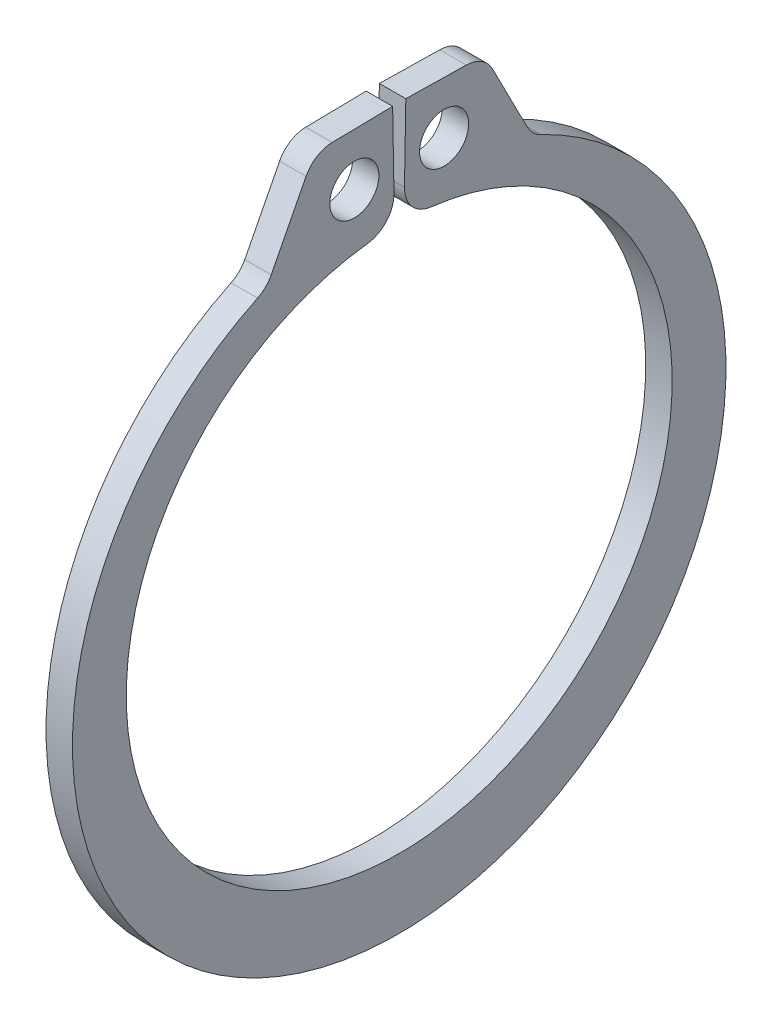
ISO-10303-21;
HEADER;
FILE_DESCRIPTION(('STEP AP214'),'2;1');
FILE_NAME('part.step','',(''),(''),'','','');
FILE_SCHEMA(('AUTOMOTIVE_DESIGN { 1 0 10303 214 1 1 1 1 }'));
ENDSEC;
DATA;
#1=APPLICATION_CONTEXT('core data for automotive mechanical design processes');
#2=APPLICATION_PROTOCOL_DEFINITION('international standard','automotive_design',2000,#1);
#3=PRODUCT_CONTEXT('',#1,'mechanical');
#4=PRODUCT('Part','Part','',(#3));
#5=PRODUCT_RELATED_PRODUCT_CATEGORY('part','',(#4));
#6=PRODUCT_DEFINITION_FORMATION('','',#4);
#7=PRODUCT_DEFINITION_CONTEXT('part definition',#1,'design');
#8=PRODUCT_DEFINITION('design','',#6,#7);
#9=PRODUCT_DEFINITION_SHAPE('','',#8);
#10=(LENGTH_UNIT() NAMED_UNIT(*) SI_UNIT(.MILLI.,.METRE.));
#11=(NAMED_UNIT(*) PLANE_ANGLE_UNIT() SI_UNIT($,.RADIAN.));
#12=(NAMED_UNIT(*) SI_UNIT($,.STERADIAN.) SOLID_ANGLE_UNIT());
#13=UNCERTAINTY_MEASURE_WITH_UNIT(LENGTH_MEASURE(1.E-05),#10,'distance_accuracy_value','');
#14=(GEOMETRIC_REPRESENTATION_CONTEXT(3) GLOBAL_UNCERTAINTY_ASSIGNED_CONTEXT((#13)) GLOBAL_UNIT_ASSIGNED_CONTEXT((#10,
#11,#12)) REPRESENTATION_CONTEXT('',''));
#15=CARTESIAN_POINT('',(0.,0.,0.));
#16=DIRECTION('',(0.,0.,1.));
#17=DIRECTION('',(1.,0.,0.));
#18=AXIS2_PLACEMENT_3D('',#15,#16,#17);
#19=CARTESIAN_POINT('',(0.5334,-0.625118312705631,0.));
#20=DIRECTION('',(1.,0.,0.));
#21=DIRECTION('',(0.,0.,-1.));
#22=AXIS2_PLACEMENT_3D('',#19,#20,#21);
#23=PLANE('',#22);
#24=CARTESIAN_POINT('',(0.5334,13.0895070250879,1.80986904848789));
#25=DIRECTION('',(1.,0.,0.));
#26=DIRECTION('',(0.,0.,-1.));
#27=AXIS2_PLACEMENT_3D('',#24,#25,#26);
#28=CIRCLE('',#27,0.9906);
#29=CARTESIAN_POINT('',(0.5334,13.0895070250879,0.819269048487891));
#30=VERTEX_POINT('',#29);
#31=EDGE_CURVE('E183',#30,#30,#28,.T.);
#32=ORIENTED_EDGE('',*,*,#31,.F.);
#33=EDGE_LOOP('',(#32));
#34=FACE_BOUND('',#33,.T.);
#35=DIRECTION('',(0.,0.889652132655338,0.456638897666206));
#36=VECTOR('',#35,1.);
#37=CARTESIAN_POINT('',(0.5334,15.1697910635783,-3.4275713949355));
#38=LINE('',#37,#36);
#39=CARTESIAN_POINT('',(0.5334,11.7880795835457,-5.1633296152392));
#40=VERTEX_POINT('',#39);
#41=CARTESIAN_POINT('',(0.5334,14.527018981979,-3.75749218534158));
#42=VERTEX_POINT('',#41);
#43=EDGE_CURVE('E189',#40,#42,#38,.T.);
#44=ORIENTED_EDGE('',*,*,#43,.T.);
#45=CARTESIAN_POINT('',(0.5334,13.9760841519447,-2.68412688729291));
#46=DIRECTION('',(1.,0.,0.));
#47=DIRECTION('',(0.,0.,-1.));
#48=AXIS2_PLACEMENT_3D('',#45,#46,#47);
#49=CIRCLE('',#48,1.2065);
#50=CARTESIAN_POINT('',(0.5334,15.1824003961509,-2.7051832156595));
#51=VERTEX_POINT('',#50);
#52=EDGE_CURVE('E228',#42,#51,#49,.T.);
#53=ORIENTED_EDGE('',*,*,#52,.T.);
#54=DIRECTION('',(0.,0.0174524064372839,0.999847695156391));
#55=VECTOR('',#54,1.);
#56=CARTESIAN_POINT('',(0.5334,15.2249808084549,-0.265753028542447));
#57=LINE('',#56,#55);
#58=CARTESIAN_POINT('',(0.5334,15.2249808084549,-0.265753028542447));
#59=VERTEX_POINT('',#58);
#60=EDGE_CURVE('E192',#51,#59,#57,.T.);
#61=ORIENTED_EDGE('',*,*,#60,.T.);
#62=DIRECTION('',(0.,-0.999847695156391,0.0174524064372838));
#63=VECTOR('',#62,1.);
#64=CARTESIAN_POINT('',(0.5334,11.0092229865975,-0.192166702040283));
#65=LINE('',#64,#63);
#66=CARTESIAN_POINT('',(0.5334,12.1558298695839,-0.212180799629953));
#67=VERTEX_POINT('',#66);
#68=EDGE_CURVE('E160',#59,#67,#65,.T.);
#69=ORIENTED_EDGE('',*,*,#68,.T.);
#70=CARTESIAN_POINT('',(0.5334,12.1347735412173,-1.41849704383614));
#71=DIRECTION('',(1.,0.,0.));
#72=DIRECTION('',(0.,0.,-1.));
#73=AXIS2_PLACEMENT_3D('',#70,#71,#72);
#74=CIRCLE('',#73,1.2065);
#75=CARTESIAN_POINT('',(0.5334,10.9364331187478,-1.27841677443444));
#76=VERTEX_POINT('',#75);
#77=EDGE_CURVE('E226',#67,#76,#74,.T.);
#78=ORIENTED_EDGE('',*,*,#77,.T.);
#79=CARTESIAN_POINT('',(0.5334,0.,0.));
#80=DIRECTION('',(-1.,0.,0.));
#81=DIRECTION('',(0.,0.,-1.));
#82=AXIS2_PLACEMENT_3D('',#79,#80,#81);
#83=CIRCLE('',#82,11.0109);
#84=CARTESIAN_POINT('',(0.5334,10.9364331187478,1.27841677443444));
#85=VERTEX_POINT('',#84);
#86=EDGE_CURVE('E195',#76,#85,#83,.T.);
#87=ORIENTED_EDGE('',*,*,#86,.T.);
#88=CARTESIAN_POINT('',(0.5334,12.1347735412173,1.41849704383614));
#89=DIRECTION('',(1.,0.,0.));
#90=DIRECTION('',(0.,0.,-1.));
#91=AXIS2_PLACEMENT_3D('',#88,#89,#90);
#92=CIRCLE('',#91,1.2065);
#93=CARTESIAN_POINT('',(0.5334,12.1558298695839,0.212180799629953));
#94=VERTEX_POINT('',#93);
#95=EDGE_CURVE('E224',#85,#94,#92,.T.);
#96=ORIENTED_EDGE('',*,*,#95,.T.);
#97=DIRECTION('',(0.,0.999847695156391,0.0174524064372835));
#98=VECTOR('',#97,1.);
#99=CARTESIAN_POINT('',(0.5334,11.0092229865975,0.192166702040285));
#100=LINE('',#99,#98);
#101=CARTESIAN_POINT('',(0.5334,15.2249808084549,0.265753028542447));
#102=VERTEX_POINT('',#101);
#103=EDGE_CURVE('E198',#94,#102,#100,.T.);
#104=ORIENTED_EDGE('',*,*,#103,.T.);
#105=DIRECTION('',(0.,-0.0174524064372839,0.999847695156391));
#106=VECTOR('',#105,1.);
#107=CARTESIAN_POINT('',(0.5334,15.2249808084549,0.265753028542447));
#108=LINE('',#107,#106);
#109=CARTESIAN_POINT('',(0.5334,15.1824003961509,2.7051832156595));
#110=VERTEX_POINT('',#109);
#111=EDGE_CURVE('E200',#102,#110,#108,.T.);
#112=ORIENTED_EDGE('',*,*,#111,.T.);
#113=CARTESIAN_POINT('',(0.5334,13.9760841519447,2.68412688729291));
#114=DIRECTION('',(1.,0.,0.));
#115=DIRECTION('',(0.,0.,-1.));
#116=AXIS2_PLACEMENT_3D('',#113,#114,#115);
#117=CIRCLE('',#116,1.2065);
#118=CARTESIAN_POINT('',(0.5334,14.527018981979,3.75749218534158));
#119=VERTEX_POINT('',#118);
#120=EDGE_CURVE('E61',#110,#119,#117,.T.);
#121=ORIENTED_EDGE('',*,*,#120,.T.);
#122=DIRECTION('',(0.,-0.889652132655339,0.456638897666205));
#123=VECTOR('',#122,1.);
#124=CARTESIAN_POINT('',(0.5334,15.1697910635783,3.4275713949355));
#125=LINE('',#124,#123);
#126=CARTESIAN_POINT('',(0.5334,11.7880795835457,5.16332961523919));
#127=VERTEX_POINT('',#126);
#128=EDGE_CURVE('E202',#119,#127,#125,.T.);
#129=ORIENTED_EDGE('',*,*,#128,.T.);
#130=CARTESIAN_POINT('',(0.5334,12.33901441358,6.23669491328786));
#131=DIRECTION('',(1.,0.,0.));
#132=DIRECTION('',(0.,0.,-1.));
#133=AXIS2_PLACEMENT_3D('',#130,#131,#132);
#134=CIRCLE('',#133,1.2065);
#135=CARTESIAN_POINT('',(0.5334,11.2517823911404,5.71365688466874));
#136=VERTEX_POINT('',#135);
#137=EDGE_CURVE('E11',#127,#136,#134,.F.);
#138=ORIENTED_EDGE('',*,*,#137,.T.);
#139=CARTESIAN_POINT('',(0.5334,-0.625118312705631,0.));
#140=DIRECTION('',(1.,0.,0.));
#141=DIRECTION('',(0.,0.,-1.));
#142=AXIS2_PLACEMENT_3D('',#139,#140,#141);
#143=CIRCLE('',#142,13.1797816872944);
#144=CARTESIAN_POINT('',(0.5334,11.2517823911404,-5.71365688466874));
#145=VERTEX_POINT('',#144);
#146=EDGE_CURVE('E186',#136,#145,#143,.T.);
#147=ORIENTED_EDGE('',*,*,#146,.T.);
#148=CARTESIAN_POINT('',(0.5334,12.33901441358,-6.23669491328786));
#149=DIRECTION('',(1.,0.,0.));
#150=DIRECTION('',(0.,0.,-1.));
#151=AXIS2_PLACEMENT_3D('',#148,#149,#150);
#152=CIRCLE('',#151,1.2065);
#153=EDGE_CURVE('E248',#145,#40,#152,.F.);
#154=ORIENTED_EDGE('',*,*,#153,.T.);
#155=EDGE_LOOP('',(#44,#53,#61,#69,#78,#87,#96,#104,#112,#121,#129,#138,#147,#154));
#156=FACE_BOUND('',#155,.T.);
#157=CARTESIAN_POINT('',(0.5334,13.0895070250879,-1.80986904848789));
#158=DIRECTION('',(1.,0.,0.));
#159=DIRECTION('',(0.,0.,-1.));
#160=AXIS2_PLACEMENT_3D('',#157,#158,#159);
#161=CIRCLE('',#160,0.990600000000001);
#162=CARTESIAN_POINT('',(0.5334,13.0895070250879,-2.80046904848789));
#163=VERTEX_POINT('',#162);
#164=EDGE_CURVE('E180',#163,#163,#161,.T.);
#165=ORIENTED_EDGE('',*,*,#164,.F.);
#166=EDGE_LOOP('',(#165));
#167=FACE_BOUND('',#166,.T.);
#168=ADVANCED_FACE('F39',(#34,#156,#167),#23,.T.);
#169=CARTESIAN_POINT('',(0.5334,-0.625118312705631,0.));
#170=DIRECTION('',(-1.,0.,0.));
#171=DIRECTION('',(0.,0.,1.));
#172=AXIS2_PLACEMENT_3D('',#169,#170,#171);
#173=CYLINDRICAL_SURFACE('',#172,13.1797816872944);
#174=CARTESIAN_POINT('',(-0.5334,-0.625118312705631,0.));
#175=DIRECTION('',(1.,0.,0.));
#176=DIRECTION('',(0.,0.,-1.));
#177=AXIS2_PLACEMENT_3D('',#174,#175,#176);
#178=CIRCLE('',#177,13.1797816872944);
#179=CARTESIAN_POINT('',(-0.5334,11.2517823911404,5.71365688466874));
#180=VERTEX_POINT('',#179);
#181=CARTESIAN_POINT('',(-0.5334,11.2517823911404,-5.71365688466874));
#182=VERTEX_POINT('',#181);
#183=EDGE_CURVE('E252',#180,#182,#178,.T.);
#184=ORIENTED_EDGE('',*,*,#183,.T.);
#185=DIRECTION('',(-1.,0.,0.));
#186=VECTOR('',#185,1.);
#187=CARTESIAN_POINT('',(0.5334,11.2517823911404,-5.71365688466874));
#188=LINE('',#187,#186);
#189=EDGE_CURVE('E213',#182,#145,#188,.F.);
#190=ORIENTED_EDGE('',*,*,#189,.T.);
#191=ORIENTED_EDGE('',*,*,#146,.F.);
#192=DIRECTION('',(-1.,0.,0.));
#193=VECTOR('',#192,1.);
#194=CARTESIAN_POINT('',(0.5334,11.2517823911404,5.71365688466874));
#195=LINE('',#194,#193);
#196=EDGE_CURVE('E210',#136,#180,#195,.T.);
#197=ORIENTED_EDGE('',*,*,#196,.T.);
#198=EDGE_LOOP('',(#184,#190,#191,#197));
#199=FACE_BOUND('',#198,.T.);
#200=ADVANCED_FACE('F262',(#199),#173,.T.);
#201=CARTESIAN_POINT('',(0.5334,15.1697910635783,-3.4275713949355));
#202=DIRECTION('',(0.,-0.456638897666206,0.889652132655339));
#203=DIRECTION('',(0.,-0.889652132655339,-0.456638897666206));
#204=AXIS2_PLACEMENT_3D('',#201,#202,#203);
#205=PLANE('',#204);
#206=ORIENTED_EDGE('',*,*,#43,.F.);
#207=DIRECTION('',(1.,0.,0.));
#208=VECTOR('',#207,1.);
#209=CARTESIAN_POINT('',(-0.5334,11.7880795835457,-5.1633296152392));
#210=LINE('',#209,#208);
#211=CARTESIAN_POINT('',(-0.5334,11.7880795835457,-5.1633296152392));
#212=VERTEX_POINT('',#211);
#213=EDGE_CURVE('E207',#40,#212,#210,.F.);
#214=ORIENTED_EDGE('',*,*,#213,.T.);
#215=DIRECTION('',(0.,0.889652132655338,0.456638897666206));
#216=VECTOR('',#215,1.);
#217=CARTESIAN_POINT('',(-0.5334,15.1697910635783,-3.4275713949355));
#218=LINE('',#217,#216);
#219=CARTESIAN_POINT('',(-0.5334,14.527018981979,-3.75749218534158));
#220=VERTEX_POINT('',#219);
#221=EDGE_CURVE('E153',#212,#220,#218,.T.);
#222=ORIENTED_EDGE('',*,*,#221,.T.);
#223=DIRECTION('',(-1.,0.,0.));
#224=VECTOR('',#223,1.);
#225=CARTESIAN_POINT('',(0.5334,14.527018981979,-3.75749218534158));
#226=LINE('',#225,#224);
#227=EDGE_CURVE('E161',#220,#42,#226,.F.);
#228=ORIENTED_EDGE('',*,*,#227,.T.);
#229=EDGE_LOOP('',(#206,#214,#222,#228));
#230=FACE_BOUND('',#229,.T.);
#231=ADVANCED_FACE('F270',(#230),#205,.F.);
#232=CARTESIAN_POINT('',(0.5334,15.2249808084549,-0.265753028542447));
#233=DIRECTION('',(0.,-0.999847695156391,0.0174524064372839));
#234=DIRECTION('',(0.,-0.0174524064372839,-0.999847695156391));
#235=AXIS2_PLACEMENT_3D('',#232,#233,#234);
#236=PLANE('',#235);
#237=ORIENTED_EDGE('',*,*,#60,.F.);
#238=DIRECTION('',(-1.,0.,0.));
#239=VECTOR('',#238,1.);
#240=CARTESIAN_POINT('',(0.5334,15.1824003961509,-2.7051832156595));
#241=LINE('',#240,#239);
#242=CARTESIAN_POINT('',(-0.5334,15.1824003961509,-2.7051832156595));
#243=VERTEX_POINT('',#242);
#244=EDGE_CURVE('E149',#51,#243,#241,.T.);
#245=ORIENTED_EDGE('',*,*,#244,.T.);
#246=DIRECTION('',(0.,0.0174524064372839,0.999847695156391));
#247=VECTOR('',#246,1.);
#248=CARTESIAN_POINT('',(-0.5334,15.2249808084549,-0.265753028542447));
#249=LINE('',#248,#247);
#250=CARTESIAN_POINT('',(-0.5334,15.2249808084549,-0.265753028542447));
#251=VERTEX_POINT('',#250);
#252=EDGE_CURVE('E142',#243,#251,#249,.T.);
#253=ORIENTED_EDGE('',*,*,#252,.T.);
#254=DIRECTION('',(-1.,0.,0.));
#255=VECTOR('',#254,1.);
#256=CARTESIAN_POINT('',(0.5334,15.2249808084549,-0.265753028542447));
#257=LINE('',#256,#255);
#258=EDGE_CURVE('E146',#59,#251,#257,.T.);
#259=ORIENTED_EDGE('',*,*,#258,.F.);
#260=EDGE_LOOP('',(#237,#245,#253,#259));
#261=FACE_BOUND('',#260,.T.);
#262=ADVANCED_FACE('F145',(#261),#236,.F.);
#263=CARTESIAN_POINT('',(0.5334,11.0092229865975,-0.192166702040283));
#264=DIRECTION('',(0.,-0.0174524064372838,-0.999847695156391));
#265=DIRECTION('',(0.,0.999847695156391,-0.0174524064372838));
#266=AXIS2_PLACEMENT_3D('',#263,#264,#265);
#267=PLANE('',#266);
#268=DIRECTION('',(0.,-0.999847695156391,0.0174524064372838));
#269=VECTOR('',#268,1.);
#270=CARTESIAN_POINT('',(-0.5334,11.0092229865975,-0.192166702040283));
#271=LINE('',#270,#269);
#272=CARTESIAN_POINT('',(-0.5334,12.1558298695839,-0.212180799629953));
#273=VERTEX_POINT('',#272);
#274=EDGE_CURVE('E152',#251,#273,#271,.T.);
#275=ORIENTED_EDGE('',*,*,#274,.T.);
#276=DIRECTION('',(-1.,0.,0.));
#277=VECTOR('',#276,1.);
#278=CARTESIAN_POINT('',(0.5334,12.1558298695839,-0.212180799629953));
#279=LINE('',#278,#277);
#280=EDGE_CURVE('E235',#273,#67,#279,.F.);
#281=ORIENTED_EDGE('',*,*,#280,.T.);
#282=ORIENTED_EDGE('',*,*,#68,.F.);
#283=ORIENTED_EDGE('',*,*,#258,.T.);
#284=EDGE_LOOP('',(#275,#281,#282,#283));
#285=FACE_BOUND('',#284,.T.);
#286=ADVANCED_FACE('F157',(#285),#267,.F.);
#287=CARTESIAN_POINT('',(0.5334,0.,0.));
#288=DIRECTION('',(-1.,0.,0.));
#289=DIRECTION('',(0.,0.,1.));
#290=AXIS2_PLACEMENT_3D('',#287,#288,#289);
#291=CYLINDRICAL_SURFACE('',#290,11.0109);
#292=ORIENTED_EDGE('',*,*,#86,.F.);
#293=DIRECTION('',(-1.,0.,0.));
#294=VECTOR('',#293,1.);
#295=CARTESIAN_POINT('',(0.5334,10.9364331187478,-1.27841677443444));
#296=LINE('',#295,#294);
#297=CARTESIAN_POINT('',(-0.5334,10.9364331187478,-1.27841677443444));
#298=VERTEX_POINT('',#297);
#299=EDGE_CURVE('E232',#76,#298,#296,.T.);
#300=ORIENTED_EDGE('',*,*,#299,.T.);
#301=CARTESIAN_POINT('',(-0.5334,0.,0.));
#302=DIRECTION('',(-1.,0.,0.));
#303=DIRECTION('',(0.,0.,-1.));
#304=AXIS2_PLACEMENT_3D('',#301,#302,#303);
#305=CIRCLE('',#304,11.0109);
#306=CARTESIAN_POINT('',(-0.5334,10.9364331187478,1.27841677443444));
#307=VERTEX_POINT('',#306);
#308=EDGE_CURVE('E167',#298,#307,#305,.T.);
#309=ORIENTED_EDGE('',*,*,#308,.T.);
#310=DIRECTION('',(-1.,0.,0.));
#311=VECTOR('',#310,1.);
#312=CARTESIAN_POINT('',(0.5334,10.9364331187478,1.27841677443444));
#313=LINE('',#312,#311);
#314=EDGE_CURVE('E230',#307,#85,#313,.F.);
#315=ORIENTED_EDGE('',*,*,#314,.T.);
#316=EDGE_LOOP('',(#292,#300,#309,#315));
#317=FACE_BOUND('',#316,.T.);
#318=ADVANCED_FACE('F282',(#317),#291,.F.);
#319=CARTESIAN_POINT('',(0.5334,11.0092229865975,0.192166702040285));
#320=DIRECTION('',(0.,-0.0174524064372835,0.999847695156391));
#321=DIRECTION('',(0.,-0.999847695156391,-0.0174524064372835));
#322=AXIS2_PLACEMENT_3D('',#319,#320,#321);
#323=PLANE('',#322);
#324=ORIENTED_EDGE('',*,*,#103,.F.);
#325=DIRECTION('',(-1.,0.,0.));
#326=VECTOR('',#325,1.);
#327=CARTESIAN_POINT('',(0.5334,12.1558298695839,0.212180799629953));
#328=LINE('',#327,#326);
#329=CARTESIAN_POINT('',(-0.5334,12.1558298695839,0.212180799629953));
#330=VERTEX_POINT('',#329);
#331=EDGE_CURVE('E237',#94,#330,#328,.T.);
#332=ORIENTED_EDGE('',*,*,#331,.T.);
#333=DIRECTION('',(0.,0.999847695156391,0.0174524064372835));
#334=VECTOR('',#333,1.);
#335=CARTESIAN_POINT('',(-0.5334,11.0092229865975,0.192166702040285));
#336=LINE('',#335,#334);
#337=CARTESIAN_POINT('',(-0.5334,15.2249808084549,0.265753028542447));
#338=VERTEX_POINT('',#337);
#339=EDGE_CURVE('E170',#330,#338,#336,.T.);
#340=ORIENTED_EDGE('',*,*,#339,.T.);
#341=DIRECTION('',(-1.,0.,0.));
#342=VECTOR('',#341,1.);
#343=CARTESIAN_POINT('',(0.5334,15.2249808084549,0.265753028542447));
#344=LINE('',#343,#342);
#345=EDGE_CURVE('E162',#102,#338,#344,.T.);
#346=ORIENTED_EDGE('',*,*,#345,.F.);
#347=EDGE_LOOP('',(#324,#332,#340,#346));
#348=FACE_BOUND('',#347,.T.);
#349=ADVANCED_FACE('F292',(#348),#323,.F.);
#350=CARTESIAN_POINT('',(0.5334,15.2249808084549,0.265753028542447));
#351=DIRECTION('',(0.,-0.999847695156391,-0.0174524064372839));
#352=DIRECTION('',(0.,0.0174524064372839,-0.999847695156391));
#353=AXIS2_PLACEMENT_3D('',#350,#351,#352);
#354=PLANE('',#353);
#355=DIRECTION('',(0.,-0.0174524064372839,0.999847695156391));
#356=VECTOR('',#355,1.);
#357=CARTESIAN_POINT('',(-0.5334,15.2249808084549,0.265753028542447));
#358=LINE('',#357,#356);
#359=CARTESIAN_POINT('',(-0.5334,15.1824003961509,2.7051832156595));
#360=VERTEX_POINT('',#359);
#361=EDGE_CURVE('E175',#338,#360,#358,.T.);
#362=ORIENTED_EDGE('',*,*,#361,.T.);
#363=DIRECTION('',(-1.,0.,0.));
#364=VECTOR('',#363,1.);
#365=CARTESIAN_POINT('',(0.5334,15.1824003961509,2.7051832156595));
#366=LINE('',#365,#364);
#367=EDGE_CURVE('E244',#360,#110,#366,.F.);
#368=ORIENTED_EDGE('',*,*,#367,.T.);
#369=ORIENTED_EDGE('',*,*,#111,.F.);
#370=ORIENTED_EDGE('',*,*,#345,.T.);
#371=EDGE_LOOP('',(#362,#368,#369,#370));
#372=FACE_BOUND('',#371,.T.);
#373=ADVANCED_FACE('F299',(#372),#354,.F.);
#374=CARTESIAN_POINT('',(0.5334,15.1697910635783,3.4275713949355));
#375=DIRECTION('',(0.,-0.456638897666205,-0.889652132655339));
#376=DIRECTION('',(0.,0.889652132655339,-0.456638897666205));
#377=AXIS2_PLACEMENT_3D('',#374,#375,#376);
#378=PLANE('',#377);
#379=ORIENTED_EDGE('',*,*,#128,.F.);
#380=DIRECTION('',(-1.,0.,0.));
#381=VECTOR('',#380,1.);
#382=CARTESIAN_POINT('',(0.5334,14.527018981979,3.75749218534158));
#383=LINE('',#382,#381);
#384=CARTESIAN_POINT('',(-0.5334,14.527018981979,3.75749218534158));
#385=VERTEX_POINT('',#384);
#386=EDGE_CURVE('E241',#119,#385,#383,.T.);
#387=ORIENTED_EDGE('',*,*,#386,.T.);
#388=DIRECTION('',(0.,-0.889652132655339,0.456638897666205));
#389=VECTOR('',#388,1.);
#390=CARTESIAN_POINT('',(-0.5334,15.1697910635783,3.4275713949355));
#391=LINE('',#390,#389);
#392=CARTESIAN_POINT('',(-0.5334,11.7880795835457,5.16332961523919));
#393=VERTEX_POINT('',#392);
#394=EDGE_CURVE('E178',#385,#393,#391,.T.);
#395=ORIENTED_EDGE('',*,*,#394,.T.);
#396=DIRECTION('',(1.,0.,0.));
#397=VECTOR('',#396,1.);
#398=CARTESIAN_POINT('',(0.5334,11.7880795835457,5.16332961523919));
#399=LINE('',#398,#397);
#400=EDGE_CURVE('E54',#393,#127,#399,.T.);
#401=ORIENTED_EDGE('',*,*,#400,.T.);
#402=EDGE_LOOP('',(#379,#387,#395,#401));
#403=FACE_BOUND('',#402,.T.);
#404=ADVANCED_FACE('F255',(#403),#378,.F.);
#405=CARTESIAN_POINT('',(0.5334,13.0895070250879,1.80986904848789));
#406=DIRECTION('',(-1.,0.,0.));
#407=DIRECTION('',(0.,0.,1.));
#408=AXIS2_PLACEMENT_3D('',#405,#406,#407);
#409=CYLINDRICAL_SURFACE('',#408,0.9906);
#410=ORIENTED_EDGE('',*,*,#31,.T.);
#411=EDGE_LOOP('',(#410));
#412=FACE_BOUND('',#411,.T.);
#413=CARTESIAN_POINT('',(-0.5334,13.0895070250879,1.80986904848789));
#414=DIRECTION('',(1.,0.,0.));
#415=DIRECTION('',(0.,0.,-1.));
#416=AXIS2_PLACEMENT_3D('',#413,#414,#415);
#417=CIRCLE('',#416,0.9906);
#418=CARTESIAN_POINT('',(-0.5334,13.0895070250879,0.819269048487891));
#419=VERTEX_POINT('',#418);
#420=EDGE_CURVE('E337',#419,#419,#417,.T.);
#421=ORIENTED_EDGE('',*,*,#420,.F.);
#422=EDGE_LOOP('',(#421));
#423=FACE_BOUND('',#422,.T.);
#424=ADVANCED_FACE('F306',(#412,#423),#409,.F.);
#425=CARTESIAN_POINT('',(0.5334,13.0895070250879,-1.80986904848789));
#426=DIRECTION('',(-1.,0.,0.));
#427=DIRECTION('',(0.,0.,1.));
#428=AXIS2_PLACEMENT_3D('',#425,#426,#427);
#429=CYLINDRICAL_SURFACE('',#428,0.990600000000001);
#430=ORIENTED_EDGE('',*,*,#164,.T.);
#431=EDGE_LOOP('',(#430));
#432=FACE_BOUND('',#431,.T.);
#433=CARTESIAN_POINT('',(-0.5334,13.0895070250879,-1.80986904848789));
#434=DIRECTION('',(1.,0.,0.));
#435=DIRECTION('',(0.,0.,-1.));
#436=AXIS2_PLACEMENT_3D('',#433,#434,#435);
#437=CIRCLE('',#436,0.990600000000001);
#438=CARTESIAN_POINT('',(-0.5334,13.0895070250879,-2.80046904848789));
#439=VERTEX_POINT('',#438);
#440=EDGE_CURVE('E334',#439,#439,#437,.T.);
#441=ORIENTED_EDGE('',*,*,#440,.F.);
#442=EDGE_LOOP('',(#441));
#443=FACE_BOUND('',#442,.T.);
#444=ADVANCED_FACE('F320',(#432,#443),#429,.F.);
#445=CARTESIAN_POINT('',(-0.5334,-0.625118312705631,0.));
#446=DIRECTION('',(1.,0.,0.));
#447=DIRECTION('',(0.,0.,-1.));
#448=AXIS2_PLACEMENT_3D('',#445,#446,#447);
#449=PLANE('',#448);
#450=ORIENTED_EDGE('',*,*,#440,.T.);
#451=EDGE_LOOP('',(#450));
#452=FACE_BOUND('',#451,.T.);
#453=ORIENTED_EDGE('',*,*,#420,.T.);
#454=EDGE_LOOP('',(#453));
#455=FACE_BOUND('',#454,.T.);
#456=ORIENTED_EDGE('',*,*,#252,.F.);
#457=CARTESIAN_POINT('',(-0.5334,13.9760841519447,-2.68412688729291));
#458=DIRECTION('',(1.,0.,0.));
#459=DIRECTION('',(0.,0.,-1.));
#460=AXIS2_PLACEMENT_3D('',#457,#458,#459);
#461=CIRCLE('',#460,1.2065);
#462=EDGE_CURVE('E221',#243,#220,#461,.F.);
#463=ORIENTED_EDGE('',*,*,#462,.T.);
#464=ORIENTED_EDGE('',*,*,#221,.F.);
#465=CARTESIAN_POINT('',(-0.5334,12.33901441358,-6.23669491328786));
#466=DIRECTION('',(1.,0.,0.));
#467=DIRECTION('',(0.,0.,-1.));
#468=AXIS2_PLACEMENT_3D('',#465,#466,#467);
#469=CIRCLE('',#468,1.2065);
#470=EDGE_CURVE('E246',#212,#182,#469,.T.);
#471=ORIENTED_EDGE('',*,*,#470,.T.);
#472=ORIENTED_EDGE('',*,*,#183,.F.);
#473=CARTESIAN_POINT('',(-0.5334,12.33901441358,6.23669491328786));
#474=DIRECTION('',(1.,0.,0.));
#475=DIRECTION('',(0.,0.,-1.));
#476=AXIS2_PLACEMENT_3D('',#473,#474,#475);
#477=CIRCLE('',#476,1.2065);
#478=EDGE_CURVE('E47',#180,#393,#477,.T.);
#479=ORIENTED_EDGE('',*,*,#478,.T.);
#480=ORIENTED_EDGE('',*,*,#394,.F.);
#481=CARTESIAN_POINT('',(-0.5334,13.9760841519447,2.68412688729291));
#482=DIRECTION('',(1.,0.,0.));
#483=DIRECTION('',(0.,0.,-1.));
#484=AXIS2_PLACEMENT_3D('',#481,#482,#483);
#485=CIRCLE('',#484,1.2065);
#486=EDGE_CURVE('E216',#385,#360,#485,.F.);
#487=ORIENTED_EDGE('',*,*,#486,.T.);
#488=ORIENTED_EDGE('',*,*,#361,.F.);
#489=ORIENTED_EDGE('',*,*,#339,.F.);
#490=CARTESIAN_POINT('',(-0.5334,12.1347735412173,1.41849704383614));
#491=DIRECTION('',(1.,0.,0.));
#492=DIRECTION('',(0.,0.,-1.));
#493=AXIS2_PLACEMENT_3D('',#490,#491,#492);
#494=CIRCLE('',#493,1.2065);
#495=EDGE_CURVE('E218',#330,#307,#494,.F.);
#496=ORIENTED_EDGE('',*,*,#495,.T.);
#497=ORIENTED_EDGE('',*,*,#308,.F.);
#498=CARTESIAN_POINT('',(-0.5334,12.1347735412173,-1.41849704383614));
#499=DIRECTION('',(1.,0.,0.));
#500=DIRECTION('',(0.,0.,-1.));
#501=AXIS2_PLACEMENT_3D('',#498,#499,#500);
#502=CIRCLE('',#501,1.2065);
#503=EDGE_CURVE('E166',#298,#273,#502,.F.);
#504=ORIENTED_EDGE('',*,*,#503,.T.);
#505=ORIENTED_EDGE('',*,*,#274,.F.);
#506=EDGE_LOOP('',(#456,#463,#464,#471,#472,#479,#480,#487,#488,#489,#496,#497,#504,#505));
#507=FACE_BOUND('',#506,.T.);
#508=ADVANCED_FACE('F164',(#452,#455,#507),#449,.F.);
#509=CARTESIAN_POINT('',(0.5334,12.33901441358,-6.23669491328786));
#510=DIRECTION('',(-1.,0.,0.));
#511=DIRECTION('',(0.,0.,1.));
#512=AXIS2_PLACEMENT_3D('',#509,#510,#511);
#513=CYLINDRICAL_SURFACE('',#512,1.2065);
#514=ORIENTED_EDGE('',*,*,#153,.F.);
#515=ORIENTED_EDGE('',*,*,#189,.F.);
#516=ORIENTED_EDGE('',*,*,#470,.F.);
#517=ORIENTED_EDGE('',*,*,#213,.F.);
#518=EDGE_LOOP('',(#514,#515,#516,#517));
#519=FACE_BOUND('',#518,.T.);
#520=ADVANCED_FACE('F265',(#519),#513,.F.);
#521=CARTESIAN_POINT('',(0.5334,13.9760841519447,-2.68412688729291));
#522=DIRECTION('',(-1.,0.,0.));
#523=DIRECTION('',(0.,0.,1.));
#524=AXIS2_PLACEMENT_3D('',#521,#522,#523);
#525=CYLINDRICAL_SURFACE('',#524,1.2065);
#526=ORIENTED_EDGE('',*,*,#52,.F.);
#527=ORIENTED_EDGE('',*,*,#227,.F.);
#528=ORIENTED_EDGE('',*,*,#462,.F.);
#529=ORIENTED_EDGE('',*,*,#244,.F.);
#530=EDGE_LOOP('',(#526,#527,#528,#529));
#531=FACE_BOUND('',#530,.T.);
#532=ADVANCED_FACE('F275',(#531),#525,.T.);
#533=CARTESIAN_POINT('',(0.5334,12.1347735412173,-1.41849704383614));
#534=DIRECTION('',(-1.,0.,0.));
#535=DIRECTION('',(0.,0.,1.));
#536=AXIS2_PLACEMENT_3D('',#533,#534,#535);
#537=CYLINDRICAL_SURFACE('',#536,1.2065);
#538=ORIENTED_EDGE('',*,*,#77,.F.);
#539=ORIENTED_EDGE('',*,*,#280,.F.);
#540=ORIENTED_EDGE('',*,*,#503,.F.);
#541=ORIENTED_EDGE('',*,*,#299,.F.);
#542=EDGE_LOOP('',(#538,#539,#540,#541));
#543=FACE_BOUND('',#542,.T.);
#544=ADVANCED_FACE('F280',(#543),#537,.T.);
#545=CARTESIAN_POINT('',(0.5334,12.1347735412173,1.41849704383614));
#546=DIRECTION('',(-1.,0.,0.));
#547=DIRECTION('',(0.,0.,1.));
#548=AXIS2_PLACEMENT_3D('',#545,#546,#547);
#549=CYLINDRICAL_SURFACE('',#548,1.2065);
#550=ORIENTED_EDGE('',*,*,#95,.F.);
#551=ORIENTED_EDGE('',*,*,#314,.F.);
#552=ORIENTED_EDGE('',*,*,#495,.F.);
#553=ORIENTED_EDGE('',*,*,#331,.F.);
#554=EDGE_LOOP('',(#550,#551,#552,#553));
#555=FACE_BOUND('',#554,.T.);
#556=ADVANCED_FACE('F289',(#555),#549,.T.);
#557=CARTESIAN_POINT('',(0.5334,13.9760841519447,2.68412688729291));
#558=DIRECTION('',(-1.,0.,0.));
#559=DIRECTION('',(0.,0.,1.));
#560=AXIS2_PLACEMENT_3D('',#557,#558,#559);
#561=CYLINDRICAL_SURFACE('',#560,1.2065);
#562=ORIENTED_EDGE('',*,*,#120,.F.);
#563=ORIENTED_EDGE('',*,*,#367,.F.);
#564=ORIENTED_EDGE('',*,*,#486,.F.);
#565=ORIENTED_EDGE('',*,*,#386,.F.);
#566=EDGE_LOOP('',(#562,#563,#564,#565));
#567=FACE_BOUND('',#566,.T.);
#568=ADVANCED_FACE('F298',(#567),#561,.T.);
#569=CARTESIAN_POINT('',(0.5334,12.33901441358,6.23669491328786));
#570=DIRECTION('',(-1.,0.,0.));
#571=DIRECTION('',(0.,0.,1.));
#572=AXIS2_PLACEMENT_3D('',#569,#570,#571);
#573=CYLINDRICAL_SURFACE('',#572,1.2065);
#574=ORIENTED_EDGE('',*,*,#137,.F.);
#575=ORIENTED_EDGE('',*,*,#400,.F.);
#576=ORIENTED_EDGE('',*,*,#478,.F.);
#577=ORIENTED_EDGE('',*,*,#196,.F.);
#578=EDGE_LOOP('',(#574,#575,#576,#577));
#579=FACE_BOUND('',#578,.T.);
#580=ADVANCED_FACE('F41',(#579),#573,.F.);
#581=CLOSED_SHELL('',(#168,#200,#231,#262,#286,#318,#349,#373,#404,#424,#444,#508,#520,#532,
#544,#556,#568,#580));
#582=MANIFOLD_SOLID_BREP('B2',#581);
#583=ADVANCED_BREP_SHAPE_REPRESENTATION('',(#18,#582),#14);
#584=SHAPE_DEFINITION_REPRESENTATION(#9,#583);
ENDSEC;
END-ISO-10303-21;
